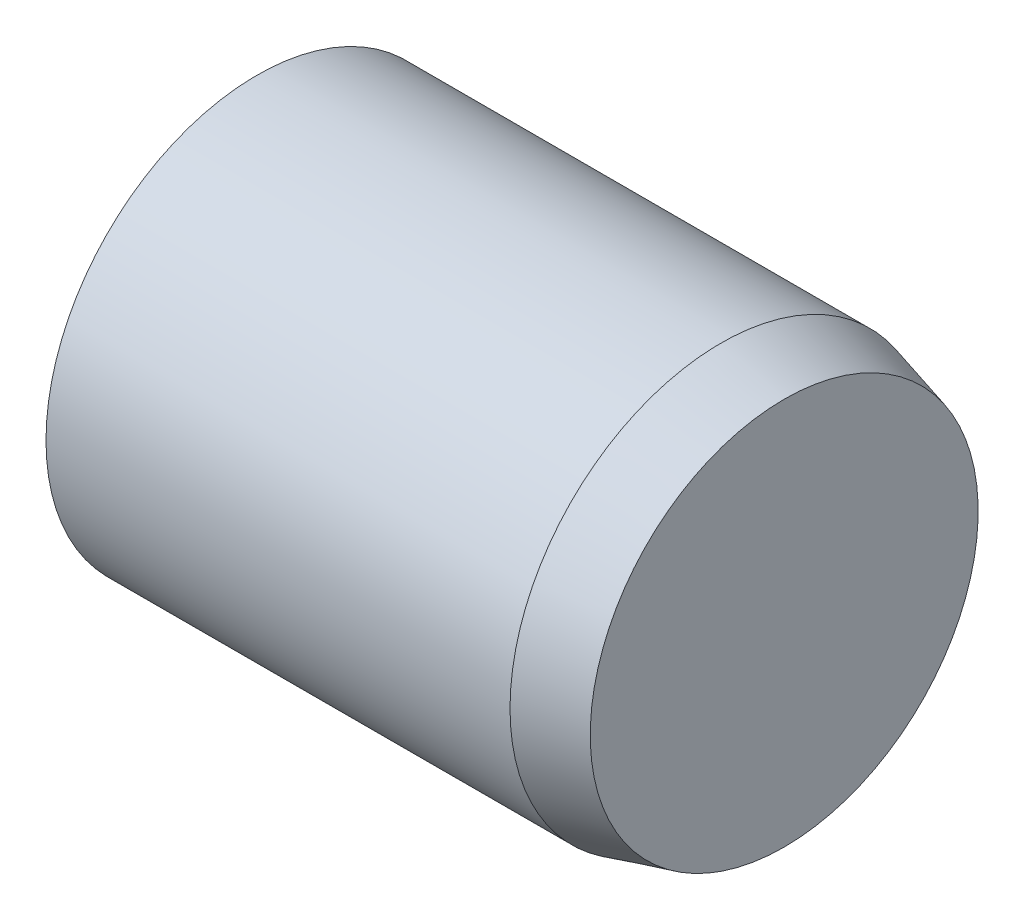
ISO-10303-21;
HEADER;
FILE_DESCRIPTION(('STEP AP214'),'2;1');
FILE_NAME('part.step','',(''),(''),'','','');
FILE_SCHEMA(('AUTOMOTIVE_DESIGN { 1 0 10303 214 1 1 1 1 }'));
ENDSEC;
DATA;
#1=APPLICATION_CONTEXT('core data for automotive mechanical design processes');
#2=APPLICATION_PROTOCOL_DEFINITION('international standard','automotive_design',2000,#1);
#3=PRODUCT_CONTEXT('',#1,'mechanical');
#4=PRODUCT('Part','Part','',(#3));
#5=PRODUCT_RELATED_PRODUCT_CATEGORY('part','',(#4));
#6=PRODUCT_DEFINITION_FORMATION('','',#4);
#7=PRODUCT_DEFINITION_CONTEXT('part definition',#1,'design');
#8=PRODUCT_DEFINITION('design','',#6,#7);
#9=PRODUCT_DEFINITION_SHAPE('','',#8);
#10=(LENGTH_UNIT() NAMED_UNIT(*) SI_UNIT(.MILLI.,.METRE.));
#11=(NAMED_UNIT(*) PLANE_ANGLE_UNIT() SI_UNIT($,.RADIAN.));
#12=(NAMED_UNIT(*) SI_UNIT($,.STERADIAN.) SOLID_ANGLE_UNIT());
#13=UNCERTAINTY_MEASURE_WITH_UNIT(LENGTH_MEASURE(1.E-05),#10,'distance_accuracy_value','');
#14=(GEOMETRIC_REPRESENTATION_CONTEXT(3) GLOBAL_UNCERTAINTY_ASSIGNED_CONTEXT((#13)) GLOBAL_UNIT_ASSIGNED_CONTEXT((#10,
#11,#12)) REPRESENTATION_CONTEXT('',''));
#15=CARTESIAN_POINT('',(0.,0.,0.));
#16=DIRECTION('',(0.,0.,1.));
#17=DIRECTION('',(1.,0.,0.));
#18=AXIS2_PLACEMENT_3D('',#15,#16,#17);
#19=CARTESIAN_POINT('',(-48.8149940900796,0.,34.515004572721));
#20=DIRECTION('',(-1.,0.,0.));
#21=DIRECTION('',(0.,0.,1.));
#22=AXIS2_PLACEMENT_3D('',#19,#20,#21);
#23=PLANE('',#22);
#24=CARTESIAN_POINT('',(-48.8149940900371,0.,36.3542350572623));
#25=DIRECTION('',(-1.,0.,0.));
#26=DIRECTION('',(0.,-1.,0.));
#27=AXIS2_PLACEMENT_3D('',#24,#25,#26);
#28=CIRCLE('',#27,1.83923048454896);
#29=CARTESIAN_POINT('',(-48.8149940900371,-1.83923048454896,36.3542350572623));
#30=VERTEX_POINT('',#29);
#31=EDGE_CURVE('E18',#30,#30,#28,.T.);
#32=ORIENTED_EDGE('',*,*,#31,.F.);
#33=EDGE_LOOP('',(#32));
#34=FACE_BOUND('',#33,.T.);
#35=ADVANCED_FACE('F15',(#34),#23,.F.);
#36=CARTESIAN_POINT('',(-49.4149940899433,0.,36.3542350572623));
#37=DIRECTION('',(-1.,0.,0.));
#38=DIRECTION('',(0.,-1.,0.));
#39=AXIS2_PLACEMENT_3D('',#36,#37,#38);
#40=CONICAL_SURFACE('',#39,1.99999999996468,0.261799387771439);
#41=CARTESIAN_POINT('',(-49.4149940900797,0.,36.3542350572623));
#42=DIRECTION('',(-1.,0.,0.));
#43=DIRECTION('',(0.,0.,1.));
#44=AXIS2_PLACEMENT_3D('',#41,#42,#43);
#45=CIRCLE('',#44,2.);
#46=CARTESIAN_POINT('',(-49.4149940900797,0.,38.3542350572624));
#47=VERTEX_POINT('',#46);
#48=EDGE_CURVE('E22',#47,#47,#45,.T.);
#49=ORIENTED_EDGE('',*,*,#48,.F.);
#50=EDGE_LOOP('',(#49));
#51=FACE_BOUND('',#50,.T.);
#52=ORIENTED_EDGE('',*,*,#31,.T.);
#53=EDGE_LOOP('',(#52));
#54=FACE_BOUND('',#53,.T.);
#55=ADVANCED_FACE('F32',(#51,#54),#40,.T.);
#56=CARTESIAN_POINT('',(-53.8149940900797,0.,36.3542350572623));
#57=DIRECTION('',(-1.,0.,0.));
#58=DIRECTION('',(0.,0.,1.));
#59=AXIS2_PLACEMENT_3D('',#56,#57,#58);
#60=PLANE('',#59);
#61=CARTESIAN_POINT('',(-53.8149940900797,0.,36.3542350572623));
#62=DIRECTION('',(-1.,0.,0.));
#63=DIRECTION('',(0.,0.,1.));
#64=AXIS2_PLACEMENT_3D('',#61,#62,#63);
#65=CIRCLE('',#64,2.);
#66=CARTESIAN_POINT('',(-53.8149940900797,0.,38.3542350572624));
#67=VERTEX_POINT('',#66);
#68=EDGE_CURVE('E10',#67,#67,#65,.F.);
#69=ORIENTED_EDGE('',*,*,#68,.F.);
#70=EDGE_LOOP('',(#69));
#71=FACE_BOUND('',#70,.T.);
#72=ADVANCED_FACE('F40',(#71),#60,.T.);
#73=CARTESIAN_POINT('',(-67.2543085382615,0.,36.3542350572623));
#74=DIRECTION('',(-1.,0.,0.));
#75=DIRECTION('',(0.,0.,1.));
#76=AXIS2_PLACEMENT_3D('',#73,#74,#75);
#77=CYLINDRICAL_SURFACE('',#76,2.);
#78=ORIENTED_EDGE('',*,*,#68,.T.);
#79=EDGE_LOOP('',(#78));
#80=FACE_BOUND('',#79,.T.);
#81=ORIENTED_EDGE('',*,*,#48,.T.);
#82=EDGE_LOOP('',(#81));
#83=FACE_BOUND('',#82,.T.);
#84=ADVANCED_FACE('F42',(#80,#83),#77,.T.);
#85=CLOSED_SHELL('',(#35,#55,#72,#84));
#86=MANIFOLD_SOLID_BREP('B1',#85);
#87=ADVANCED_BREP_SHAPE_REPRESENTATION('',(#18,#86),#14);
#88=SHAPE_DEFINITION_REPRESENTATION(#9,#87);
ENDSEC;
END-ISO-10303-21;
